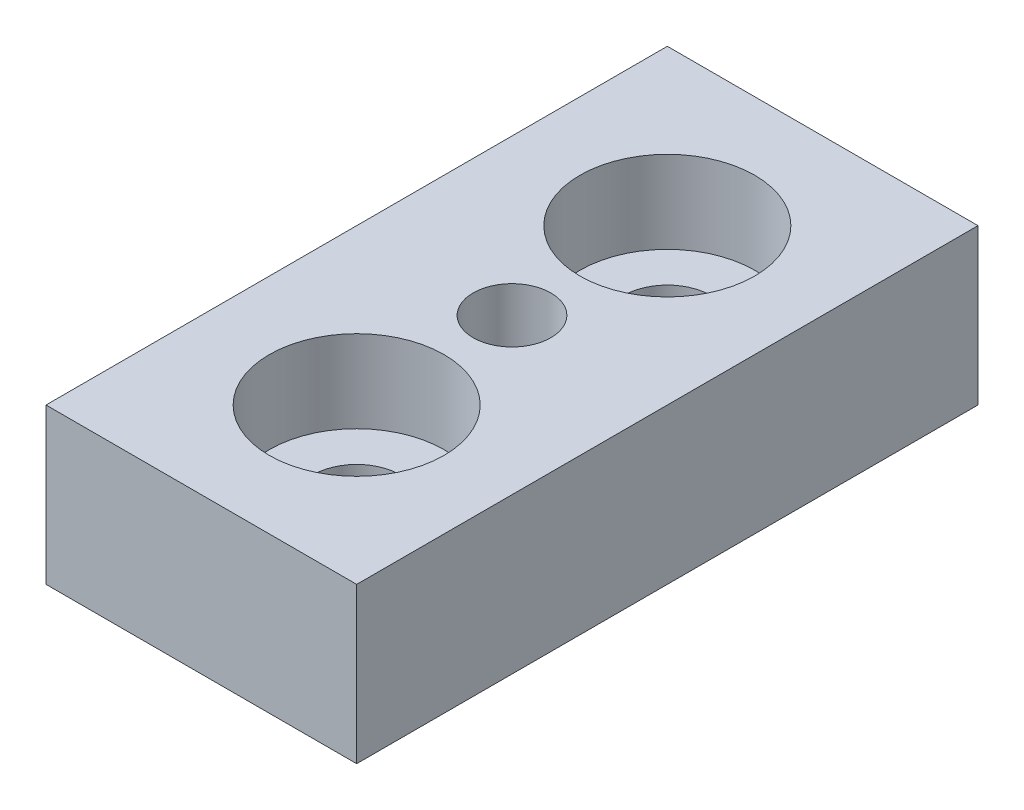
ISO-10303-21;
HEADER;
FILE_DESCRIPTION(('STEP AP214'),'2;1');
FILE_NAME('part.step','',(''),(''),'','','');
FILE_SCHEMA(('AUTOMOTIVE_DESIGN { 1 0 10303 214 1 1 1 1 }'));
ENDSEC;
DATA;
#1=APPLICATION_CONTEXT('core data for automotive mechanical design processes');
#2=APPLICATION_PROTOCOL_DEFINITION('international standard','automotive_design',2000,#1);
#3=PRODUCT_CONTEXT('',#1,'mechanical');
#4=PRODUCT('Part','Part','',(#3));
#5=PRODUCT_RELATED_PRODUCT_CATEGORY('part','',(#4));
#6=PRODUCT_DEFINITION_FORMATION('','',#4);
#7=PRODUCT_DEFINITION_CONTEXT('part definition',#1,'design');
#8=PRODUCT_DEFINITION('design','',#6,#7);
#9=PRODUCT_DEFINITION_SHAPE('','',#8);
#10=(LENGTH_UNIT() NAMED_UNIT(*) SI_UNIT(.MILLI.,.METRE.));
#11=(NAMED_UNIT(*) PLANE_ANGLE_UNIT() SI_UNIT($,.RADIAN.));
#12=(NAMED_UNIT(*) SI_UNIT($,.STERADIAN.) SOLID_ANGLE_UNIT());
#13=UNCERTAINTY_MEASURE_WITH_UNIT(LENGTH_MEASURE(1.E-05),#10,'distance_accuracy_value','');
#14=(GEOMETRIC_REPRESENTATION_CONTEXT(3) GLOBAL_UNCERTAINTY_ASSIGNED_CONTEXT((#13)) GLOBAL_UNIT_ASSIGNED_CONTEXT((#10,
#11,#12)) REPRESENTATION_CONTEXT('',''));
#15=CARTESIAN_POINT('',(0.,0.,0.));
#16=DIRECTION('',(0.,0.,1.));
#17=DIRECTION('',(1.,0.,0.));
#18=AXIS2_PLACEMENT_3D('',#15,#16,#17);
#19=CARTESIAN_POINT('',(-12.7,12.7,-25.4));
#20=DIRECTION('',(1.,0.,0.));
#21=DIRECTION('',(0.,0.,-1.));
#22=AXIS2_PLACEMENT_3D('',#19,#20,#21);
#23=PLANE('',#22);
#24=DIRECTION('',(0.,0.,1.));
#25=VECTOR('',#24,1.);
#26=CARTESIAN_POINT('',(-12.7,0.,-25.4));
#27=LINE('',#26,#25);
#28=CARTESIAN_POINT('',(-12.7,0.,-25.4));
#29=VERTEX_POINT('',#28);
#30=CARTESIAN_POINT('',(-12.7,0.,25.4));
#31=VERTEX_POINT('',#30);
#32=EDGE_CURVE('E94',#29,#31,#27,.T.);
#33=ORIENTED_EDGE('',*,*,#32,.T.);
#34=DIRECTION('',(0.,-1.,0.));
#35=VECTOR('',#34,1.);
#36=CARTESIAN_POINT('',(-12.7,12.7,25.4));
#37=LINE('',#36,#35);
#38=CARTESIAN_POINT('',(-12.7,12.7,25.4));
#39=VERTEX_POINT('',#38);
#40=EDGE_CURVE('E11',#39,#31,#37,.T.);
#41=ORIENTED_EDGE('',*,*,#40,.F.);
#42=DIRECTION('',(0.,0.,1.));
#43=VECTOR('',#42,1.);
#44=CARTESIAN_POINT('',(-12.7,12.7,-25.4));
#45=LINE('',#44,#43);
#46=CARTESIAN_POINT('',(-12.7,12.7,-25.4));
#47=VERTEX_POINT('',#46);
#48=EDGE_CURVE('E82',#47,#39,#45,.T.);
#49=ORIENTED_EDGE('',*,*,#48,.F.);
#50=DIRECTION('',(0.,-1.,0.));
#51=VECTOR('',#50,1.);
#52=CARTESIAN_POINT('',(-12.7,12.7,-25.4));
#53=LINE('',#52,#51);
#54=EDGE_CURVE('E90',#47,#29,#53,.T.);
#55=ORIENTED_EDGE('',*,*,#54,.T.);
#56=EDGE_LOOP('',(#33,#41,#49,#55));
#57=FACE_BOUND('',#56,.T.);
#58=ADVANCED_FACE('F31',(#57),#23,.F.);
#59=CARTESIAN_POINT('',(-12.7,12.7,25.4));
#60=DIRECTION('',(0.,0.,-1.));
#61=DIRECTION('',(-1.,0.,0.));
#62=AXIS2_PLACEMENT_3D('',#59,#60,#61);
#63=PLANE('',#62);
#64=DIRECTION('',(1.,0.,0.));
#65=VECTOR('',#64,1.);
#66=CARTESIAN_POINT('',(-12.7,0.,25.4));
#67=LINE('',#66,#65);
#68=CARTESIAN_POINT('',(12.7,0.,25.4));
#69=VERTEX_POINT('',#68);
#70=EDGE_CURVE('E86',#31,#69,#67,.T.);
#71=ORIENTED_EDGE('',*,*,#70,.T.);
#72=DIRECTION('',(0.,-1.,0.));
#73=VECTOR('',#72,1.);
#74=CARTESIAN_POINT('',(12.7,12.7,25.4));
#75=LINE('',#74,#73);
#76=CARTESIAN_POINT('',(12.7,12.7,25.4));
#77=VERTEX_POINT('',#76);
#78=EDGE_CURVE('E39',#77,#69,#75,.T.);
#79=ORIENTED_EDGE('',*,*,#78,.F.);
#80=DIRECTION('',(1.,0.,0.));
#81=VECTOR('',#80,1.);
#82=CARTESIAN_POINT('',(-12.7,12.7,25.4));
#83=LINE('',#82,#81);
#84=EDGE_CURVE('E77',#39,#77,#83,.T.);
#85=ORIENTED_EDGE('',*,*,#84,.F.);
#86=ORIENTED_EDGE('',*,*,#40,.T.);
#87=EDGE_LOOP('',(#71,#79,#85,#86));
#88=FACE_BOUND('',#87,.T.);
#89=ADVANCED_FACE('F85',(#88),#63,.F.);
#90=CARTESIAN_POINT('',(12.7,12.7,-25.4));
#91=DIRECTION('',(-1.,0.,0.));
#92=DIRECTION('',(0.,0.,1.));
#93=AXIS2_PLACEMENT_3D('',#90,#91,#92);
#94=PLANE('',#93);
#95=DIRECTION('',(0.,0.,-1.));
#96=VECTOR('',#95,1.);
#97=CARTESIAN_POINT('',(12.7,0.,-25.4));
#98=LINE('',#97,#96);
#99=CARTESIAN_POINT('',(12.7,0.,-25.4));
#100=VERTEX_POINT('',#99);
#101=EDGE_CURVE('E64',#69,#100,#98,.T.);
#102=ORIENTED_EDGE('',*,*,#101,.T.);
#103=DIRECTION('',(0.,-1.,0.));
#104=VECTOR('',#103,1.);
#105=CARTESIAN_POINT('',(12.7,12.7,-25.4));
#106=LINE('',#105,#104);
#107=CARTESIAN_POINT('',(12.7,12.7,-25.4));
#108=VERTEX_POINT('',#107);
#109=EDGE_CURVE('E87',#108,#100,#106,.T.);
#110=ORIENTED_EDGE('',*,*,#109,.F.);
#111=DIRECTION('',(0.,0.,-1.));
#112=VECTOR('',#111,1.);
#113=CARTESIAN_POINT('',(12.7,12.7,-25.4));
#114=LINE('',#113,#112);
#115=EDGE_CURVE('E80',#77,#108,#114,.T.);
#116=ORIENTED_EDGE('',*,*,#115,.F.);
#117=ORIENTED_EDGE('',*,*,#78,.T.);
#118=EDGE_LOOP('',(#102,#110,#116,#117));
#119=FACE_BOUND('',#118,.T.);
#120=ADVANCED_FACE('F88',(#119),#94,.F.);
#121=CARTESIAN_POINT('',(-12.7,12.7,-25.4));
#122=DIRECTION('',(0.,0.,1.));
#123=DIRECTION('',(1.,0.,0.));
#124=AXIS2_PLACEMENT_3D('',#121,#122,#123);
#125=PLANE('',#124);
#126=DIRECTION('',(-1.,0.,0.));
#127=VECTOR('',#126,1.);
#128=CARTESIAN_POINT('',(-12.7,0.,-25.4));
#129=LINE('',#128,#127);
#130=EDGE_CURVE('E70',#100,#29,#129,.T.);
#131=ORIENTED_EDGE('',*,*,#130,.T.);
#132=ORIENTED_EDGE('',*,*,#54,.F.);
#133=DIRECTION('',(-1.,0.,0.));
#134=VECTOR('',#133,1.);
#135=CARTESIAN_POINT('',(-12.7,12.7,-25.4));
#136=LINE('',#135,#134);
#137=EDGE_CURVE('E47',#108,#47,#136,.T.);
#138=ORIENTED_EDGE('',*,*,#137,.F.);
#139=ORIENTED_EDGE('',*,*,#109,.T.);
#140=EDGE_LOOP('',(#131,#132,#138,#139));
#141=FACE_BOUND('',#140,.T.);
#142=ADVANCED_FACE('F102',(#141),#125,.F.);
#143=CARTESIAN_POINT('',(-12.7,12.7,25.4));
#144=DIRECTION('',(0.,1.,0.));
#145=DIRECTION('',(0.,0.,1.));
#146=AXIS2_PLACEMENT_3D('',#143,#144,#145);
#147=PLANE('',#146);
#148=CARTESIAN_POINT('',(0.,12.7,-12.7));
#149=DIRECTION('',(0.,1.,0.));
#150=DIRECTION('',(0.,0.,1.));
#151=AXIS2_PLACEMENT_3D('',#148,#149,#150);
#152=CIRCLE('',#151,7.14375);
#153=CARTESIAN_POINT('',(0.,12.7,-5.55625));
#154=VERTEX_POINT('',#153);
#155=EDGE_CURVE('E134',#154,#154,#152,.T.);
#156=ORIENTED_EDGE('',*,*,#155,.F.);
#157=EDGE_LOOP('',(#156));
#158=FACE_BOUND('',#157,.T.);
#159=CARTESIAN_POINT('',(0.,12.7,12.7));
#160=DIRECTION('',(0.,1.,0.));
#161=DIRECTION('',(0.,0.,1.));
#162=AXIS2_PLACEMENT_3D('',#159,#160,#161);
#163=CIRCLE('',#162,7.14375);
#164=CARTESIAN_POINT('',(0.,12.7,19.84375));
#165=VERTEX_POINT('',#164);
#166=EDGE_CURVE('E122',#165,#165,#163,.T.);
#167=ORIENTED_EDGE('',*,*,#166,.F.);
#168=EDGE_LOOP('',(#167));
#169=FACE_BOUND('',#168,.T.);
#170=CARTESIAN_POINT('',(0.,12.7,0.));
#171=DIRECTION('',(0.,1.,0.));
#172=DIRECTION('',(0.,0.,1.));
#173=AXIS2_PLACEMENT_3D('',#170,#171,#172);
#174=CIRCLE('',#173,3.17499999999999);
#175=CARTESIAN_POINT('',(0.,12.7,3.17499999999999));
#176=VERTEX_POINT('',#175);
#177=EDGE_CURVE('E110',#176,#176,#174,.T.);
#178=ORIENTED_EDGE('',*,*,#177,.F.);
#179=EDGE_LOOP('',(#178));
#180=FACE_BOUND('',#179,.T.);
#181=ORIENTED_EDGE('',*,*,#48,.T.);
#182=ORIENTED_EDGE('',*,*,#84,.T.);
#183=ORIENTED_EDGE('',*,*,#115,.T.);
#184=ORIENTED_EDGE('',*,*,#137,.T.);
#185=EDGE_LOOP('',(#181,#182,#183,#184));
#186=FACE_BOUND('',#185,.T.);
#187=ADVANCED_FACE('F78',(#158,#169,#180,#186),#147,.T.);
#188=CARTESIAN_POINT('',(-12.7,0.,25.4));
#189=DIRECTION('',(0.,1.,0.));
#190=DIRECTION('',(0.,0.,1.));
#191=AXIS2_PLACEMENT_3D('',#188,#189,#190);
#192=PLANE('',#191);
#193=CARTESIAN_POINT('',(0.,0.,-12.7));
#194=DIRECTION('',(0.,1.,0.));
#195=DIRECTION('',(0.,0.,1.));
#196=AXIS2_PLACEMENT_3D('',#193,#194,#195);
#197=CIRCLE('',#196,3.57124);
#198=CARTESIAN_POINT('',(0.,0.,-9.12876));
#199=VERTEX_POINT('',#198);
#200=EDGE_CURVE('E125',#199,#199,#197,.T.);
#201=ORIENTED_EDGE('',*,*,#200,.T.);
#202=EDGE_LOOP('',(#201));
#203=FACE_BOUND('',#202,.T.);
#204=CARTESIAN_POINT('',(0.,0.,12.7));
#205=DIRECTION('',(0.,1.,0.));
#206=DIRECTION('',(0.,0.,1.));
#207=AXIS2_PLACEMENT_3D('',#204,#205,#206);
#208=CIRCLE('',#207,3.57124);
#209=CARTESIAN_POINT('',(0.,0.,16.27124));
#210=VERTEX_POINT('',#209);
#211=EDGE_CURVE('E113',#210,#210,#208,.T.);
#212=ORIENTED_EDGE('',*,*,#211,.T.);
#213=EDGE_LOOP('',(#212));
#214=FACE_BOUND('',#213,.T.);
#215=CARTESIAN_POINT('',(0.,0.,0.));
#216=DIRECTION('',(0.,1.,0.));
#217=DIRECTION('',(0.,0.,1.));
#218=AXIS2_PLACEMENT_3D('',#215,#216,#217);
#219=CIRCLE('',#218,3.175);
#220=CARTESIAN_POINT('',(0.,0.,3.175));
#221=VERTEX_POINT('',#220);
#222=EDGE_CURVE('E97',#221,#221,#219,.T.);
#223=ORIENTED_EDGE('',*,*,#222,.T.);
#224=EDGE_LOOP('',(#223));
#225=FACE_BOUND('',#224,.T.);
#226=ORIENTED_EDGE('',*,*,#32,.F.);
#227=ORIENTED_EDGE('',*,*,#130,.F.);
#228=ORIENTED_EDGE('',*,*,#101,.F.);
#229=ORIENTED_EDGE('',*,*,#70,.F.);
#230=EDGE_LOOP('',(#226,#227,#228,#229));
#231=FACE_BOUND('',#230,.T.);
#232=ADVANCED_FACE('F105',(#203,#214,#225,#231),#192,.F.);
#233=CARTESIAN_POINT('',(0.,12.7,0.));
#234=DIRECTION('',(0.,1.,0.));
#235=DIRECTION('',(0.,0.,1.));
#236=AXIS2_PLACEMENT_3D('',#233,#234,#235);
#237=CYLINDRICAL_SURFACE('',#236,3.17499999999999);
#238=ORIENTED_EDGE('',*,*,#222,.F.);
#239=EDGE_LOOP('',(#238));
#240=FACE_BOUND('',#239,.T.);
#241=ORIENTED_EDGE('',*,*,#177,.T.);
#242=EDGE_LOOP('',(#241));
#243=FACE_BOUND('',#242,.T.);
#244=ADVANCED_FACE('F147',(#240,#243),#237,.F.);
#245=CARTESIAN_POINT('',(0.,12.7,12.7));
#246=DIRECTION('',(0.,1.,0.));
#247=DIRECTION('',(0.,0.,1.));
#248=AXIS2_PLACEMENT_3D('',#245,#246,#247);
#249=CYLINDRICAL_SURFACE('',#248,3.57124);
#250=ORIENTED_EDGE('',*,*,#211,.F.);
#251=EDGE_LOOP('',(#250));
#252=FACE_BOUND('',#251,.T.);
#253=CARTESIAN_POINT('',(0.,5.969,12.7));
#254=DIRECTION('',(0.,1.,0.));
#255=DIRECTION('',(0.,0.,1.));
#256=AXIS2_PLACEMENT_3D('',#253,#254,#255);
#257=CIRCLE('',#256,3.57124);
#258=CARTESIAN_POINT('',(0.,5.969,16.27124));
#259=VERTEX_POINT('',#258);
#260=EDGE_CURVE('E116',#259,#259,#257,.T.);
#261=ORIENTED_EDGE('',*,*,#260,.T.);
#262=EDGE_LOOP('',(#261));
#263=FACE_BOUND('',#262,.T.);
#264=ADVANCED_FACE('F149',(#252,#263),#249,.F.);
#265=CARTESIAN_POINT('',(3.57124,5.969,12.7));
#266=DIRECTION('',(0.,-1.,0.));
#267=DIRECTION('',(0.,0.,-1.));
#268=AXIS2_PLACEMENT_3D('',#265,#266,#267);
#269=PLANE('',#268);
#270=ORIENTED_EDGE('',*,*,#260,.F.);
#271=EDGE_LOOP('',(#270));
#272=FACE_BOUND('',#271,.T.);
#273=CARTESIAN_POINT('',(0.,5.969,12.7));
#274=DIRECTION('',(0.,1.,0.));
#275=DIRECTION('',(0.,0.,1.));
#276=AXIS2_PLACEMENT_3D('',#273,#274,#275);
#277=CIRCLE('',#276,7.14375);
#278=CARTESIAN_POINT('',(0.,5.969,19.84375));
#279=VERTEX_POINT('',#278);
#280=EDGE_CURVE('E119',#279,#279,#277,.T.);
#281=ORIENTED_EDGE('',*,*,#280,.T.);
#282=EDGE_LOOP('',(#281));
#283=FACE_BOUND('',#282,.T.);
#284=ADVANCED_FACE('F156',(#272,#283),#269,.F.);
#285=CARTESIAN_POINT('',(0.,12.7,12.7));
#286=DIRECTION('',(0.,1.,0.));
#287=DIRECTION('',(0.,0.,1.));
#288=AXIS2_PLACEMENT_3D('',#285,#286,#287);
#289=CYLINDRICAL_SURFACE('',#288,7.14375);
#290=ORIENTED_EDGE('',*,*,#280,.F.);
#291=EDGE_LOOP('',(#290));
#292=FACE_BOUND('',#291,.T.);
#293=ORIENTED_EDGE('',*,*,#166,.T.);
#294=EDGE_LOOP('',(#293));
#295=FACE_BOUND('',#294,.T.);
#296=ADVANCED_FACE('F200',(#292,#295),#289,.F.);
#297=CARTESIAN_POINT('',(0.,12.7,-12.7));
#298=DIRECTION('',(0.,1.,0.));
#299=DIRECTION('',(0.,0.,1.));
#300=AXIS2_PLACEMENT_3D('',#297,#298,#299);
#301=CYLINDRICAL_SURFACE('',#300,3.57124);
#302=ORIENTED_EDGE('',*,*,#200,.F.);
#303=EDGE_LOOP('',(#302));
#304=FACE_BOUND('',#303,.T.);
#305=CARTESIAN_POINT('',(0.,5.969,-12.7));
#306=DIRECTION('',(0.,1.,0.));
#307=DIRECTION('',(0.,0.,1.));
#308=AXIS2_PLACEMENT_3D('',#305,#306,#307);
#309=CIRCLE('',#308,3.57124);
#310=CARTESIAN_POINT('',(0.,5.969,-9.12876));
#311=VERTEX_POINT('',#310);
#312=EDGE_CURVE('E128',#311,#311,#309,.T.);
#313=ORIENTED_EDGE('',*,*,#312,.T.);
#314=EDGE_LOOP('',(#313));
#315=FACE_BOUND('',#314,.T.);
#316=ADVANCED_FACE('F210',(#304,#315),#301,.F.);
#317=CARTESIAN_POINT('',(3.57124,5.969,-12.7));
#318=DIRECTION('',(0.,-1.,0.));
#319=DIRECTION('',(0.,0.,-1.));
#320=AXIS2_PLACEMENT_3D('',#317,#318,#319);
#321=PLANE('',#320);
#322=ORIENTED_EDGE('',*,*,#312,.F.);
#323=EDGE_LOOP('',(#322));
#324=FACE_BOUND('',#323,.T.);
#325=CARTESIAN_POINT('',(0.,5.969,-12.7));
#326=DIRECTION('',(0.,1.,0.));
#327=DIRECTION('',(0.,0.,1.));
#328=AXIS2_PLACEMENT_3D('',#325,#326,#327);
#329=CIRCLE('',#328,7.14375);
#330=CARTESIAN_POINT('',(0.,5.969,-5.55625));
#331=VERTEX_POINT('',#330);
#332=EDGE_CURVE('E131',#331,#331,#329,.T.);
#333=ORIENTED_EDGE('',*,*,#332,.T.);
#334=EDGE_LOOP('',(#333));
#335=FACE_BOUND('',#334,.T.);
#336=ADVANCED_FACE('F220',(#324,#335),#321,.F.);
#337=CARTESIAN_POINT('',(0.,12.7,-12.7));
#338=DIRECTION('',(0.,1.,0.));
#339=DIRECTION('',(0.,0.,1.));
#340=AXIS2_PLACEMENT_3D('',#337,#338,#339);
#341=CYLINDRICAL_SURFACE('',#340,7.14375);
#342=ORIENTED_EDGE('',*,*,#332,.F.);
#343=EDGE_LOOP('',(#342));
#344=FACE_BOUND('',#343,.T.);
#345=ORIENTED_EDGE('',*,*,#155,.T.);
#346=EDGE_LOOP('',(#345));
#347=FACE_BOUND('',#346,.T.);
#348=ADVANCED_FACE('F138',(#344,#347),#341,.F.);
#349=CLOSED_SHELL('',(#58,#89,#120,#142,#187,#232,#244,#264,#284,#296,#316,#336,#348));
#350=MANIFOLD_SOLID_BREP('B2',#349);
#351=ADVANCED_BREP_SHAPE_REPRESENTATION('',(#18,#350),#14);
#352=SHAPE_DEFINITION_REPRESENTATION(#9,#351);
ENDSEC;
END-ISO-10303-21;
